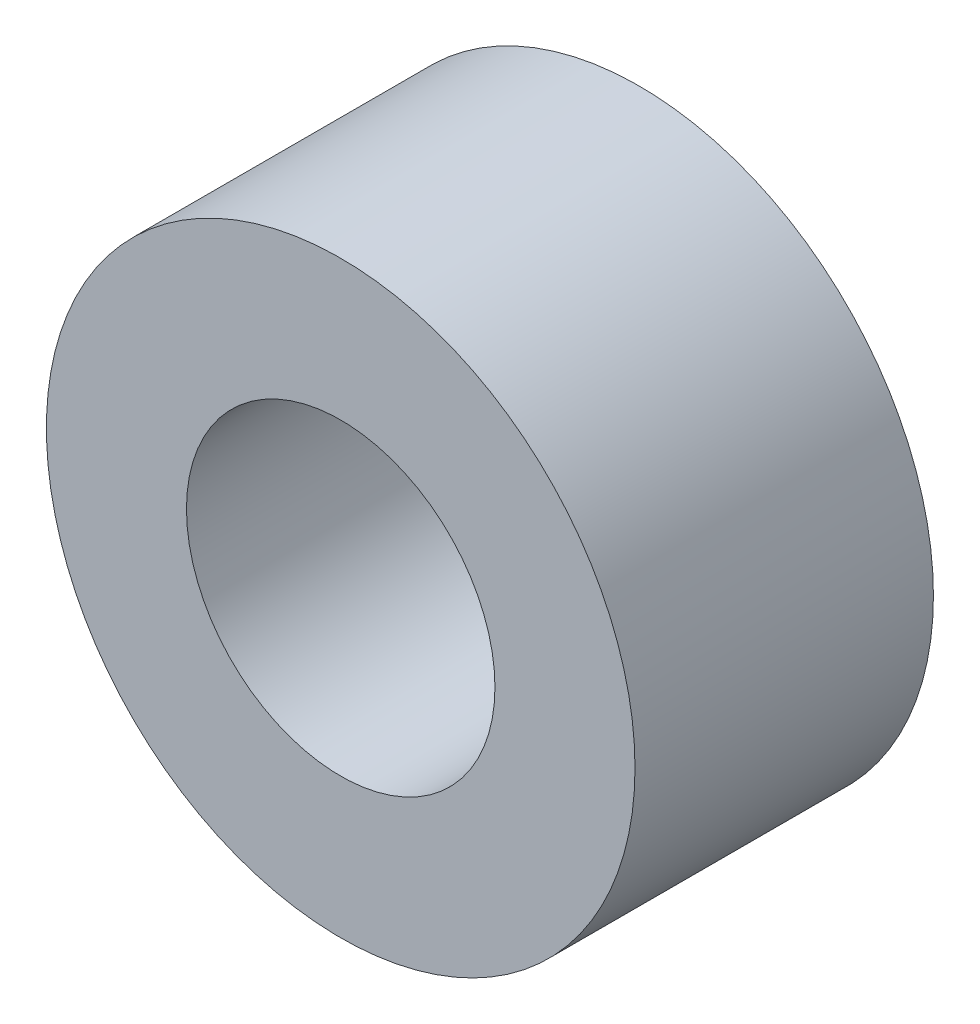
ISO-10303-21;
HEADER;
FILE_DESCRIPTION(('STEP AP214'),'2;1');
FILE_NAME('part.step','',(''),(''),'','','');
FILE_SCHEMA(('AUTOMOTIVE_DESIGN { 1 0 10303 214 1 1 1 1 }'));
ENDSEC;
DATA;
#1=APPLICATION_CONTEXT('core data for automotive mechanical design processes');
#2=APPLICATION_PROTOCOL_DEFINITION('international standard','automotive_design',2000,#1);
#3=PRODUCT_CONTEXT('',#1,'mechanical');
#4=PRODUCT('Part','Part','',(#3));
#5=PRODUCT_RELATED_PRODUCT_CATEGORY('part','',(#4));
#6=PRODUCT_DEFINITION_FORMATION('','',#4);
#7=PRODUCT_DEFINITION_CONTEXT('part definition',#1,'design');
#8=PRODUCT_DEFINITION('design','',#6,#7);
#9=PRODUCT_DEFINITION_SHAPE('','',#8);
#10=(LENGTH_UNIT() NAMED_UNIT(*) SI_UNIT(.MILLI.,.METRE.));
#11=(NAMED_UNIT(*) PLANE_ANGLE_UNIT() SI_UNIT($,.RADIAN.));
#12=(NAMED_UNIT(*) SI_UNIT($,.STERADIAN.) SOLID_ANGLE_UNIT());
#13=UNCERTAINTY_MEASURE_WITH_UNIT(LENGTH_MEASURE(1.E-05),#10,'distance_accuracy_value','');
#14=(GEOMETRIC_REPRESENTATION_CONTEXT(3) GLOBAL_UNCERTAINTY_ASSIGNED_CONTEXT((#13)) GLOBAL_UNIT_ASSIGNED_CONTEXT((#10,
#11,#12)) REPRESENTATION_CONTEXT('',''));
#15=CARTESIAN_POINT('',(0.,0.,0.));
#16=DIRECTION('',(0.,0.,1.));
#17=DIRECTION('',(1.,0.,0.));
#18=AXIS2_PLACEMENT_3D('',#15,#16,#17);
#19=CARTESIAN_POINT('',(0.,0.,8.));
#20=DIRECTION('',(0.,0.,1.));
#21=DIRECTION('',(1.,0.,0.));
#22=AXIS2_PLACEMENT_3D('',#19,#20,#21);
#23=PLANE('',#22);
#24=CARTESIAN_POINT('',(0.,0.,8.));
#25=DIRECTION('',(0.,0.,1.));
#26=DIRECTION('',(1.,0.,0.));
#27=AXIS2_PLACEMENT_3D('',#24,#25,#26);
#28=CIRCLE('',#27,7.89);
#29=CARTESIAN_POINT('',(7.89,0.,8.));
#30=VERTEX_POINT('',#29);
#31=EDGE_CURVE('E10',#30,#30,#28,.T.);
#32=ORIENTED_EDGE('',*,*,#31,.T.);
#33=EDGE_LOOP('',(#32));
#34=FACE_BOUND('',#33,.T.);
#35=CARTESIAN_POINT('',(0.,0.,8.));
#36=DIRECTION('',(0.,0.,1.));
#37=DIRECTION('',(1.,0.,0.));
#38=AXIS2_PLACEMENT_3D('',#35,#36,#37);
#39=CIRCLE('',#38,4.135);
#40=CARTESIAN_POINT('',(4.135,0.,8.));
#41=VERTEX_POINT('',#40);
#42=EDGE_CURVE('E48',#41,#41,#39,.T.);
#43=ORIENTED_EDGE('',*,*,#42,.F.);
#44=EDGE_LOOP('',(#43));
#45=FACE_BOUND('',#44,.T.);
#46=ADVANCED_FACE('F37',(#34,#45),#23,.T.);
#47=CARTESIAN_POINT('',(0.,0.,0.));
#48=DIRECTION('',(0.,0.,1.));
#49=DIRECTION('',(1.,0.,0.));
#50=AXIS2_PLACEMENT_3D('',#47,#48,#49);
#51=PLANE('',#50);
#52=CARTESIAN_POINT('',(0.,0.,0.));
#53=DIRECTION('',(0.,0.,1.));
#54=DIRECTION('',(1.,0.,0.));
#55=AXIS2_PLACEMENT_3D('',#52,#53,#54);
#56=CIRCLE('',#55,7.89);
#57=CARTESIAN_POINT('',(7.89,0.,0.));
#58=VERTEX_POINT('',#57);
#59=EDGE_CURVE('E41',#58,#58,#56,.T.);
#60=ORIENTED_EDGE('',*,*,#59,.F.);
#61=EDGE_LOOP('',(#60));
#62=FACE_BOUND('',#61,.T.);
#63=CARTESIAN_POINT('',(0.,0.,0.));
#64=DIRECTION('',(0.,0.,1.));
#65=DIRECTION('',(1.,0.,0.));
#66=AXIS2_PLACEMENT_3D('',#63,#64,#65);
#67=CIRCLE('',#66,4.135);
#68=CARTESIAN_POINT('',(4.135,0.,0.));
#69=VERTEX_POINT('',#68);
#70=EDGE_CURVE('E50',#69,#69,#67,.T.);
#71=ORIENTED_EDGE('',*,*,#70,.T.);
#72=EDGE_LOOP('',(#71));
#73=FACE_BOUND('',#72,.T.);
#74=ADVANCED_FACE('F60',(#62,#73),#51,.F.);
#75=CARTESIAN_POINT('',(0.,0.,8.));
#76=DIRECTION('',(0.,0.,-1.));
#77=DIRECTION('',(-1.,0.,0.));
#78=AXIS2_PLACEMENT_3D('',#75,#76,#77);
#79=CYLINDRICAL_SURFACE('',#78,7.89);
#80=ORIENTED_EDGE('',*,*,#31,.F.);
#81=EDGE_LOOP('',(#80));
#82=FACE_BOUND('',#81,.T.);
#83=ORIENTED_EDGE('',*,*,#59,.T.);
#84=EDGE_LOOP('',(#83));
#85=FACE_BOUND('',#84,.T.);
#86=ADVANCED_FACE('F39',(#82,#85),#79,.T.);
#87=CARTESIAN_POINT('',(0.,0.,8.));
#88=DIRECTION('',(0.,0.,-1.));
#89=DIRECTION('',(-1.,0.,0.));
#90=AXIS2_PLACEMENT_3D('',#87,#88,#89);
#91=CYLINDRICAL_SURFACE('',#90,4.135);
#92=ORIENTED_EDGE('',*,*,#42,.T.);
#93=EDGE_LOOP('',(#92));
#94=FACE_BOUND('',#93,.T.);
#95=ORIENTED_EDGE('',*,*,#70,.F.);
#96=EDGE_LOOP('',(#95));
#97=FACE_BOUND('',#96,.T.);
#98=ADVANCED_FACE('F56',(#94,#97),#91,.F.);
#99=CLOSED_SHELL('',(#46,#74,#86,#98));
#100=MANIFOLD_SOLID_BREP('B2',#99);
#101=ADVANCED_BREP_SHAPE_REPRESENTATION('',(#18,#100),#14);
#102=SHAPE_DEFINITION_REPRESENTATION(#9,#101);
ENDSEC;
END-ISO-10303-21;
